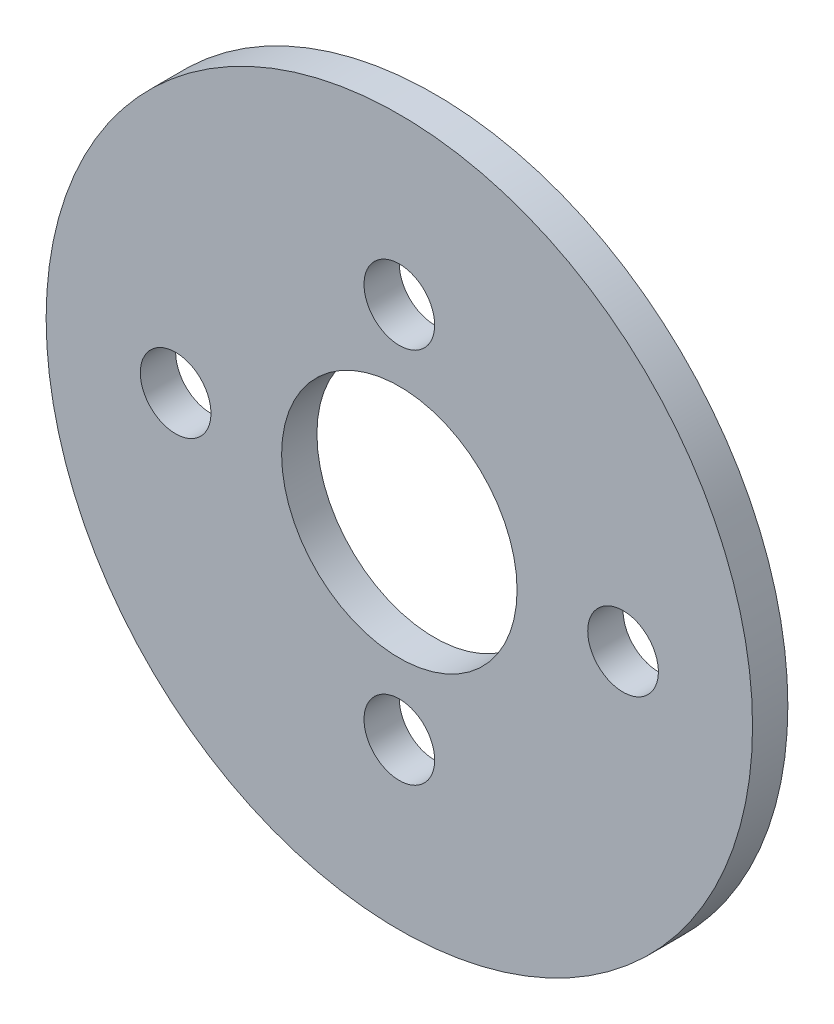
ISO-10303-21;
HEADER;
FILE_DESCRIPTION(('STEP AP214'),'2;1');
FILE_NAME('part.step','',(''),(''),'','','');
FILE_SCHEMA(('AUTOMOTIVE_DESIGN { 1 0 10303 214 1 1 1 1 }'));
ENDSEC;
DATA;
#1=APPLICATION_CONTEXT('core data for automotive mechanical design processes');
#2=APPLICATION_PROTOCOL_DEFINITION('international standard','automotive_design',2000,#1);
#3=PRODUCT_CONTEXT('',#1,'mechanical');
#4=PRODUCT('Part','Part','',(#3));
#5=PRODUCT_RELATED_PRODUCT_CATEGORY('part','',(#4));
#6=PRODUCT_DEFINITION_FORMATION('','',#4);
#7=PRODUCT_DEFINITION_CONTEXT('part definition',#1,'design');
#8=PRODUCT_DEFINITION('design','',#6,#7);
#9=PRODUCT_DEFINITION_SHAPE('','',#8);
#10=(LENGTH_UNIT() NAMED_UNIT(*) SI_UNIT(.MILLI.,.METRE.));
#11=(NAMED_UNIT(*) PLANE_ANGLE_UNIT() SI_UNIT($,.RADIAN.));
#12=(NAMED_UNIT(*) SI_UNIT($,.STERADIAN.) SOLID_ANGLE_UNIT());
#13=UNCERTAINTY_MEASURE_WITH_UNIT(LENGTH_MEASURE(1.E-05),#10,'distance_accuracy_value','');
#14=(GEOMETRIC_REPRESENTATION_CONTEXT(3) GLOBAL_UNCERTAINTY_ASSIGNED_CONTEXT((#13)) GLOBAL_UNIT_ASSIGNED_CONTEXT((#10,
#11,#12)) REPRESENTATION_CONTEXT('',''));
#15=CARTESIAN_POINT('',(0.,0.,0.));
#16=DIRECTION('',(0.,0.,1.));
#17=DIRECTION('',(1.,0.,0.));
#18=AXIS2_PLACEMENT_3D('',#15,#16,#17);
#19=CARTESIAN_POINT('',(300.,667.332012286218,-408.357743681072));
#20=DIRECTION('',(0.,0.,-1.));
#21=DIRECTION('',(-1.,0.,0.));
#22=AXIS2_PLACEMENT_3D('',#19,#20,#21);
#23=PLANE('',#22);
#24=CARTESIAN_POINT('',(290.5,667.332012286216,-408.357743681072));
#25=DIRECTION('',(0.,0.,-1.));
#26=DIRECTION('',(-1.,0.,0.));
#27=AXIS2_PLACEMENT_3D('',#24,#25,#26);
#28=CIRCLE('',#27,1.5);
#29=CARTESIAN_POINT('',(289.,667.332012286216,-408.357743681072));
#30=VERTEX_POINT('',#29);
#31=EDGE_CURVE('E41',#30,#30,#28,.F.);
#32=ORIENTED_EDGE('',*,*,#31,.T.);
#33=EDGE_LOOP('',(#32));
#34=FACE_BOUND('',#33,.T.);
#35=CARTESIAN_POINT('',(300.,667.332012286218,-408.357743681072));
#36=DIRECTION('',(0.,0.,-1.));
#37=DIRECTION('',(-1.,0.,0.));
#38=AXIS2_PLACEMENT_3D('',#35,#36,#37);
#39=CIRCLE('',#38,5.);
#40=CARTESIAN_POINT('',(295.,667.332012286218,-408.357743681072));
#41=VERTEX_POINT('',#40);
#42=EDGE_CURVE('E44',#41,#41,#39,.F.);
#43=ORIENTED_EDGE('',*,*,#42,.T.);
#44=EDGE_LOOP('',(#43));
#45=FACE_BOUND('',#44,.T.);
#46=CARTESIAN_POINT('',(309.500000000001,667.332012286216,-408.357743681072));
#47=DIRECTION('',(0.,0.,-1.));
#48=DIRECTION('',(-1.,0.,0.));
#49=AXIS2_PLACEMENT_3D('',#46,#47,#48);
#50=CIRCLE('',#49,1.5);
#51=CARTESIAN_POINT('',(308.000000000001,667.332012286216,-408.357743681072));
#52=VERTEX_POINT('',#51);
#53=EDGE_CURVE('E47',#52,#52,#50,.F.);
#54=ORIENTED_EDGE('',*,*,#53,.T.);
#55=EDGE_LOOP('',(#54));
#56=FACE_BOUND('',#55,.T.);
#57=CARTESIAN_POINT('',(300.000000000001,675.332012286216,-408.357743681072));
#58=DIRECTION('',(0.,0.,1.));
#59=DIRECTION('',(1.,0.,0.));
#60=AXIS2_PLACEMENT_3D('',#57,#58,#59);
#61=CIRCLE('',#60,1.5);
#62=CARTESIAN_POINT('',(301.500000000001,675.332012286216,-408.357743681072));
#63=VERTEX_POINT('',#62);
#64=EDGE_CURVE('E50',#63,#63,#61,.T.);
#65=ORIENTED_EDGE('',*,*,#64,.T.);
#66=EDGE_LOOP('',(#65));
#67=FACE_BOUND('',#66,.T.);
#68=CARTESIAN_POINT('',(300.000000000001,659.332012286216,-408.357743681072));
#69=DIRECTION('',(0.,0.,1.));
#70=DIRECTION('',(1.,0.,0.));
#71=AXIS2_PLACEMENT_3D('',#68,#69,#70);
#72=CIRCLE('',#71,1.5);
#73=CARTESIAN_POINT('',(301.500000000001,659.332012286216,-408.357743681072));
#74=VERTEX_POINT('',#73);
#75=EDGE_CURVE('E52',#74,#74,#72,.T.);
#76=ORIENTED_EDGE('',*,*,#75,.T.);
#77=EDGE_LOOP('',(#76));
#78=FACE_BOUND('',#77,.T.);
#79=CARTESIAN_POINT('',(300.,667.332012286218,-408.357743681072));
#80=DIRECTION('',(0.,0.,1.));
#81=DIRECTION('',(1.,0.,0.));
#82=AXIS2_PLACEMENT_3D('',#79,#80,#81);
#83=CIRCLE('',#82,15.);
#84=CARTESIAN_POINT('',(315.,667.332012286218,-408.357743681072));
#85=VERTEX_POINT('',#84);
#86=EDGE_CURVE('E18',#85,#85,#83,.T.);
#87=ORIENTED_EDGE('',*,*,#86,.F.);
#88=EDGE_LOOP('',(#87));
#89=FACE_BOUND('',#88,.T.);
#90=ADVANCED_FACE('F15',(#34,#45,#56,#67,#78,#89),#23,.T.);
#91=CARTESIAN_POINT('',(300.,667.332012286218,-407.607743681072));
#92=DIRECTION('',(0.,0.,1.));
#93=DIRECTION('',(1.,0.,0.));
#94=AXIS2_PLACEMENT_3D('',#91,#92,#93);
#95=CYLINDRICAL_SURFACE('',#94,15.);
#96=CARTESIAN_POINT('',(300.,667.332012286218,-406.857743681072));
#97=DIRECTION('',(0.,0.,1.));
#98=DIRECTION('',(1.,0.,0.));
#99=AXIS2_PLACEMENT_3D('',#96,#97,#98);
#100=CIRCLE('',#99,15.);
#101=CARTESIAN_POINT('',(315.,667.332012286218,-406.857743681072));
#102=VERTEX_POINT('',#101);
#103=EDGE_CURVE('E38',#102,#102,#100,.T.);
#104=ORIENTED_EDGE('',*,*,#103,.F.);
#105=EDGE_LOOP('',(#104));
#106=FACE_BOUND('',#105,.T.);
#107=ORIENTED_EDGE('',*,*,#86,.T.);
#108=EDGE_LOOP('',(#107));
#109=FACE_BOUND('',#108,.T.);
#110=ADVANCED_FACE('F59',(#106,#109),#95,.T.);
#111=CARTESIAN_POINT('',(300.000000000001,659.332012286216,-407.607743681072));
#112=DIRECTION('',(0.,0.,1.));
#113=DIRECTION('',(1.,0.,0.));
#114=AXIS2_PLACEMENT_3D('',#111,#112,#113);
#115=CYLINDRICAL_SURFACE('',#114,1.5);
#116=CARTESIAN_POINT('',(300.000000000001,659.332012286216,-406.857743681072));
#117=DIRECTION('',(0.,0.,1.));
#118=DIRECTION('',(1.,0.,0.));
#119=AXIS2_PLACEMENT_3D('',#116,#117,#118);
#120=CIRCLE('',#119,1.5);
#121=CARTESIAN_POINT('',(301.500000000001,659.332012286216,-406.857743681072));
#122=VERTEX_POINT('',#121);
#123=EDGE_CURVE('E35',#122,#122,#120,.F.);
#124=ORIENTED_EDGE('',*,*,#123,.F.);
#125=EDGE_LOOP('',(#124));
#126=FACE_BOUND('',#125,.T.);
#127=ORIENTED_EDGE('',*,*,#75,.F.);
#128=EDGE_LOOP('',(#127));
#129=FACE_BOUND('',#128,.T.);
#130=ADVANCED_FACE('F67',(#126,#129),#115,.F.);
#131=CARTESIAN_POINT('',(300.000000000001,675.332012286216,-407.607743681072));
#132=DIRECTION('',(0.,0.,1.));
#133=DIRECTION('',(1.,0.,0.));
#134=AXIS2_PLACEMENT_3D('',#131,#132,#133);
#135=CYLINDRICAL_SURFACE('',#134,1.5);
#136=CARTESIAN_POINT('',(300.000000000001,675.332012286216,-406.857743681072));
#137=DIRECTION('',(0.,0.,1.));
#138=DIRECTION('',(1.,0.,0.));
#139=AXIS2_PLACEMENT_3D('',#136,#137,#138);
#140=CIRCLE('',#139,1.5);
#141=CARTESIAN_POINT('',(301.500000000001,675.332012286216,-406.857743681072));
#142=VERTEX_POINT('',#141);
#143=EDGE_CURVE('E32',#142,#142,#140,.F.);
#144=ORIENTED_EDGE('',*,*,#143,.F.);
#145=EDGE_LOOP('',(#144));
#146=FACE_BOUND('',#145,.T.);
#147=ORIENTED_EDGE('',*,*,#64,.F.);
#148=EDGE_LOOP('',(#147));
#149=FACE_BOUND('',#148,.T.);
#150=ADVANCED_FACE('F88',(#146,#149),#135,.F.);
#151=CARTESIAN_POINT('',(309.500000000001,667.332012286216,-410.562497510496));
#152=DIRECTION('',(0.,0.,-1.));
#153=DIRECTION('',(-1.,0.,0.));
#154=AXIS2_PLACEMENT_3D('',#151,#152,#153);
#155=CYLINDRICAL_SURFACE('',#154,1.5);
#156=CARTESIAN_POINT('',(309.500000000001,667.332012286216,-406.857743681072));
#157=DIRECTION('',(0.,0.,-1.));
#158=DIRECTION('',(-1.,0.,0.));
#159=AXIS2_PLACEMENT_3D('',#156,#157,#158);
#160=CIRCLE('',#159,1.5);
#161=CARTESIAN_POINT('',(308.000000000001,667.332012286216,-406.857743681072));
#162=VERTEX_POINT('',#161);
#163=EDGE_CURVE('E27',#162,#162,#160,.T.);
#164=ORIENTED_EDGE('',*,*,#163,.F.);
#165=EDGE_LOOP('',(#164));
#166=FACE_BOUND('',#165,.T.);
#167=ORIENTED_EDGE('',*,*,#53,.F.);
#168=EDGE_LOOP('',(#167));
#169=FACE_BOUND('',#168,.T.);
#170=ADVANCED_FACE('F84',(#166,#169),#155,.F.);
#171=CARTESIAN_POINT('',(300.,667.332012286218,-409.574466648502));
#172=DIRECTION('',(0.,0.,-1.));
#173=DIRECTION('',(-1.,0.,0.));
#174=AXIS2_PLACEMENT_3D('',#171,#172,#173);
#175=CYLINDRICAL_SURFACE('',#174,5.);
#176=CARTESIAN_POINT('',(300.,667.332012286218,-406.857743681072));
#177=DIRECTION('',(0.,0.,-1.));
#178=DIRECTION('',(-1.,0.,0.));
#179=AXIS2_PLACEMENT_3D('',#176,#177,#178);
#180=CIRCLE('',#179,5.);
#181=CARTESIAN_POINT('',(295.,667.332012286218,-406.857743681072));
#182=VERTEX_POINT('',#181);
#183=EDGE_CURVE('E22',#182,#182,#180,.T.);
#184=ORIENTED_EDGE('',*,*,#183,.F.);
#185=EDGE_LOOP('',(#184));
#186=FACE_BOUND('',#185,.T.);
#187=ORIENTED_EDGE('',*,*,#42,.F.);
#188=EDGE_LOOP('',(#187));
#189=FACE_BOUND('',#188,.T.);
#190=ADVANCED_FACE('F77',(#186,#189),#175,.F.);
#191=CARTESIAN_POINT('',(290.5,667.332012286216,-410.562497510496));
#192=DIRECTION('',(0.,0.,-1.));
#193=DIRECTION('',(-1.,0.,0.));
#194=AXIS2_PLACEMENT_3D('',#191,#192,#193);
#195=CYLINDRICAL_SURFACE('',#194,1.5);
#196=CARTESIAN_POINT('',(290.5,667.332012286216,-406.857743681072));
#197=DIRECTION('',(0.,0.,-1.));
#198=DIRECTION('',(-1.,0.,0.));
#199=AXIS2_PLACEMENT_3D('',#196,#197,#198);
#200=CIRCLE('',#199,1.5);
#201=CARTESIAN_POINT('',(289.,667.332012286216,-406.857743681072));
#202=VERTEX_POINT('',#201);
#203=EDGE_CURVE('E10',#202,#202,#200,.T.);
#204=ORIENTED_EDGE('',*,*,#203,.F.);
#205=EDGE_LOOP('',(#204));
#206=FACE_BOUND('',#205,.T.);
#207=ORIENTED_EDGE('',*,*,#31,.F.);
#208=EDGE_LOOP('',(#207));
#209=FACE_BOUND('',#208,.T.);
#210=ADVANCED_FACE('F72',(#206,#209),#195,.F.);
#211=CARTESIAN_POINT('',(300.,667.332012286218,-406.857743681072));
#212=DIRECTION('',(0.,0.,1.));
#213=DIRECTION('',(1.,0.,0.));
#214=AXIS2_PLACEMENT_3D('',#211,#212,#213);
#215=PLANE('',#214);
#216=ORIENTED_EDGE('',*,*,#203,.T.);
#217=EDGE_LOOP('',(#216));
#218=FACE_BOUND('',#217,.T.);
#219=ORIENTED_EDGE('',*,*,#183,.T.);
#220=EDGE_LOOP('',(#219));
#221=FACE_BOUND('',#220,.T.);
#222=ORIENTED_EDGE('',*,*,#163,.T.);
#223=EDGE_LOOP('',(#222));
#224=FACE_BOUND('',#223,.T.);
#225=ORIENTED_EDGE('',*,*,#143,.T.);
#226=EDGE_LOOP('',(#225));
#227=FACE_BOUND('',#226,.T.);
#228=ORIENTED_EDGE('',*,*,#123,.T.);
#229=EDGE_LOOP('',(#228));
#230=FACE_BOUND('',#229,.T.);
#231=ORIENTED_EDGE('',*,*,#103,.T.);
#232=EDGE_LOOP('',(#231));
#233=FACE_BOUND('',#232,.T.);
#234=ADVANCED_FACE('F70',(#218,#221,#224,#227,#230,#233),#215,.T.);
#235=CLOSED_SHELL('',(#90,#110,#130,#150,#170,#190,#210,#234));
#236=MANIFOLD_SOLID_BREP('B1',#235);
#237=ADVANCED_BREP_SHAPE_REPRESENTATION('',(#18,#236),#14);
#238=SHAPE_DEFINITION_REPRESENTATION(#9,#237);
ENDSEC;
END-ISO-10303-21;
